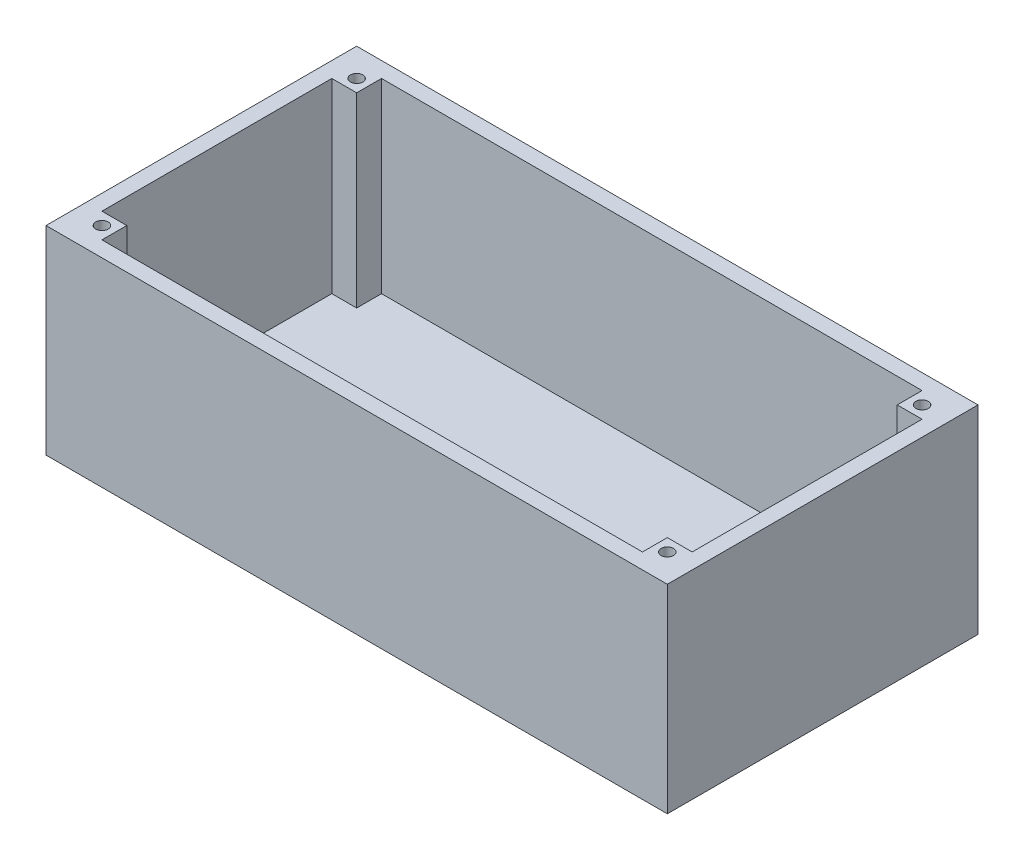
ISO-10303-21;
HEADER;
FILE_DESCRIPTION(('STEP AP214'),'2;1');
FILE_NAME('part.step','',(''),(''),'','','');
FILE_SCHEMA(('AUTOMOTIVE_DESIGN { 1 0 10303 214 1 1 1 1 }'));
ENDSEC;
DATA;
#1=APPLICATION_CONTEXT('core data for automotive mechanical design processes');
#2=APPLICATION_PROTOCOL_DEFINITION('international standard','automotive_design',2000,#1);
#3=PRODUCT_CONTEXT('',#1,'mechanical');
#4=PRODUCT('Part','Part','',(#3));
#5=PRODUCT_RELATED_PRODUCT_CATEGORY('part','',(#4));
#6=PRODUCT_DEFINITION_FORMATION('','',#4);
#7=PRODUCT_DEFINITION_CONTEXT('part definition',#1,'design');
#8=PRODUCT_DEFINITION('design','',#6,#7);
#9=PRODUCT_DEFINITION_SHAPE('','',#8);
#10=(LENGTH_UNIT() NAMED_UNIT(*) SI_UNIT(.MILLI.,.METRE.));
#11=(NAMED_UNIT(*) PLANE_ANGLE_UNIT() SI_UNIT($,.RADIAN.));
#12=(NAMED_UNIT(*) SI_UNIT($,.STERADIAN.) SOLID_ANGLE_UNIT());
#13=UNCERTAINTY_MEASURE_WITH_UNIT(LENGTH_MEASURE(1.E-05),#10,'distance_accuracy_value','');
#14=(GEOMETRIC_REPRESENTATION_CONTEXT(3) GLOBAL_UNCERTAINTY_ASSIGNED_CONTEXT((#13)) GLOBAL_UNIT_ASSIGNED_CONTEXT((#10,
#11,#12)) REPRESENTATION_CONTEXT('',''));
#15=CARTESIAN_POINT('',(0.,0.,0.));
#16=DIRECTION('',(0.,0.,1.));
#17=DIRECTION('',(1.,0.,0.));
#18=AXIS2_PLACEMENT_3D('',#15,#16,#17);
#19=CARTESIAN_POINT('',(0.,2.,0.));
#20=DIRECTION('',(1.,0.,0.));
#21=DIRECTION('',(0.,0.,-1.));
#22=AXIS2_PLACEMENT_3D('',#19,#20,#21);
#23=PLANE('',#22);
#24=DIRECTION('',(0.,0.,1.));
#25=VECTOR('',#24,1.);
#26=CARTESIAN_POINT('',(0.,0.,0.));
#27=LINE('',#26,#25);
#28=CARTESIAN_POINT('',(0.,0.,-50.));
#29=VERTEX_POINT('',#28);
#30=CARTESIAN_POINT('',(0.,0.,0.));
#31=VERTEX_POINT('',#30);
#32=EDGE_CURVE('E263',#29,#31,#27,.T.);
#33=ORIENTED_EDGE('',*,*,#32,.T.);
#34=DIRECTION('',(0.,-1.,0.));
#35=VECTOR('',#34,1.);
#36=CARTESIAN_POINT('',(0.,2.,0.));
#37=LINE('',#36,#35);
#38=CARTESIAN_POINT('',(0.,32.,0.));
#39=VERTEX_POINT('',#38);
#40=EDGE_CURVE('E11',#39,#31,#37,.T.);
#41=ORIENTED_EDGE('',*,*,#40,.F.);
#42=DIRECTION('',(0.,0.,1.));
#43=VECTOR('',#42,1.);
#44=CARTESIAN_POINT('',(0.,32.,-50.));
#45=LINE('',#44,#43);
#46=CARTESIAN_POINT('',(0.,32.,-50.));
#47=VERTEX_POINT('',#46);
#48=EDGE_CURVE('E249',#47,#39,#45,.T.);
#49=ORIENTED_EDGE('',*,*,#48,.F.);
#50=DIRECTION('',(0.,-1.,0.));
#51=VECTOR('',#50,1.);
#52=CARTESIAN_POINT('',(0.,2.,-50.));
#53=LINE('',#52,#51);
#54=EDGE_CURVE('E271',#47,#29,#53,.T.);
#55=ORIENTED_EDGE('',*,*,#54,.T.);
#56=EDGE_LOOP('',(#33,#41,#49,#55));
#57=FACE_BOUND('',#56,.T.);
#58=ADVANCED_FACE('F32',(#57),#23,.F.);
#59=CARTESIAN_POINT('',(0.,2.,0.));
#60=DIRECTION('',(0.,0.,-1.));
#61=DIRECTION('',(-1.,0.,0.));
#62=AXIS2_PLACEMENT_3D('',#59,#60,#61);
#63=PLANE('',#62);
#64=DIRECTION('',(1.,0.,0.));
#65=VECTOR('',#64,1.);
#66=CARTESIAN_POINT('',(0.,0.,0.));
#67=LINE('',#66,#65);
#68=CARTESIAN_POINT('',(100.,0.,0.));
#69=VERTEX_POINT('',#68);
#70=EDGE_CURVE('E266',#31,#69,#67,.T.);
#71=ORIENTED_EDGE('',*,*,#70,.T.);
#72=DIRECTION('',(0.,-1.,0.));
#73=VECTOR('',#72,1.);
#74=CARTESIAN_POINT('',(100.,2.,0.));
#75=LINE('',#74,#73);
#76=CARTESIAN_POINT('',(100.,32.,0.));
#77=VERTEX_POINT('',#76);
#78=EDGE_CURVE('E39',#77,#69,#75,.T.);
#79=ORIENTED_EDGE('',*,*,#78,.F.);
#80=DIRECTION('',(1.,0.,0.));
#81=VECTOR('',#80,1.);
#82=CARTESIAN_POINT('',(0.,32.,0.));
#83=LINE('',#82,#81);
#84=EDGE_CURVE('E254',#39,#77,#83,.T.);
#85=ORIENTED_EDGE('',*,*,#84,.F.);
#86=ORIENTED_EDGE('',*,*,#40,.T.);
#87=EDGE_LOOP('',(#71,#79,#85,#86));
#88=FACE_BOUND('',#87,.T.);
#89=ADVANCED_FACE('F290',(#88),#63,.F.);
#90=CARTESIAN_POINT('',(100.,2.,0.));
#91=DIRECTION('',(-1.,0.,0.));
#92=DIRECTION('',(0.,0.,1.));
#93=AXIS2_PLACEMENT_3D('',#90,#91,#92);
#94=PLANE('',#93);
#95=DIRECTION('',(0.,0.,-1.));
#96=VECTOR('',#95,1.);
#97=CARTESIAN_POINT('',(100.,0.,0.));
#98=LINE('',#97,#96);
#99=CARTESIAN_POINT('',(100.,0.,-50.));
#100=VERTEX_POINT('',#99);
#101=EDGE_CURVE('E268',#69,#100,#98,.T.);
#102=ORIENTED_EDGE('',*,*,#101,.T.);
#103=DIRECTION('',(0.,-1.,0.));
#104=VECTOR('',#103,1.);
#105=CARTESIAN_POINT('',(100.,2.,-50.));
#106=LINE('',#105,#104);
#107=CARTESIAN_POINT('',(100.,32.,-50.));
#108=VERTEX_POINT('',#107);
#109=EDGE_CURVE('E273',#108,#100,#106,.T.);
#110=ORIENTED_EDGE('',*,*,#109,.F.);
#111=DIRECTION('',(0.,0.,-1.));
#112=VECTOR('',#111,1.);
#113=CARTESIAN_POINT('',(100.,32.,-50.));
#114=LINE('',#113,#112);
#115=EDGE_CURVE('E257',#77,#108,#114,.T.);
#116=ORIENTED_EDGE('',*,*,#115,.F.);
#117=ORIENTED_EDGE('',*,*,#78,.T.);
#118=EDGE_LOOP('',(#102,#110,#116,#117));
#119=FACE_BOUND('',#118,.T.);
#120=ADVANCED_FACE('F278',(#119),#94,.F.);
#121=CARTESIAN_POINT('',(0.,2.,-50.));
#122=DIRECTION('',(0.,0.,1.));
#123=DIRECTION('',(1.,0.,0.));
#124=AXIS2_PLACEMENT_3D('',#121,#122,#123);
#125=PLANE('',#124);
#126=DIRECTION('',(-1.,0.,0.));
#127=VECTOR('',#126,1.);
#128=CARTESIAN_POINT('',(0.,0.,-50.));
#129=LINE('',#128,#127);
#130=EDGE_CURVE('E54',#100,#29,#129,.T.);
#131=ORIENTED_EDGE('',*,*,#130,.T.);
#132=ORIENTED_EDGE('',*,*,#54,.F.);
#133=DIRECTION('',(-1.,0.,0.));
#134=VECTOR('',#133,1.);
#135=CARTESIAN_POINT('',(0.,32.,-50.));
#136=LINE('',#135,#134);
#137=EDGE_CURVE('E260',#108,#47,#136,.T.);
#138=ORIENTED_EDGE('',*,*,#137,.F.);
#139=ORIENTED_EDGE('',*,*,#109,.T.);
#140=EDGE_LOOP('',(#131,#132,#138,#139));
#141=FACE_BOUND('',#140,.T.);
#142=ADVANCED_FACE('F287',(#141),#125,.F.);
#143=CARTESIAN_POINT('',(0.,0.,0.));
#144=DIRECTION('',(0.,-1.,0.));
#145=DIRECTION('',(0.,0.,-1.));
#146=AXIS2_PLACEMENT_3D('',#143,#144,#145);
#147=PLANE('',#146);
#148=ORIENTED_EDGE('',*,*,#32,.F.);
#149=ORIENTED_EDGE('',*,*,#130,.F.);
#150=ORIENTED_EDGE('',*,*,#101,.F.);
#151=ORIENTED_EDGE('',*,*,#70,.F.);
#152=EDGE_LOOP('',(#148,#149,#150,#151));
#153=FACE_BOUND('',#152,.T.);
#154=ADVANCED_FACE('F283',(#153),#147,.T.);
#155=CARTESIAN_POINT('',(0.,32.,0.));
#156=DIRECTION('',(0.,1.,0.));
#157=DIRECTION('',(0.,0.,1.));
#158=AXIS2_PLACEMENT_3D('',#155,#156,#157);
#159=PLANE('',#158);
#160=CARTESIAN_POINT('',(95.5000000000004,32.,-4.5));
#161=DIRECTION('',(0.,1.,0.));
#162=DIRECTION('',(0.,0.,1.));
#163=AXIS2_PLACEMENT_3D('',#160,#161,#162);
#164=CIRCLE('',#163,0.999999999999998);
#165=CARTESIAN_POINT('',(95.5000000000004,32.,-3.5));
#166=VERTEX_POINT('',#165);
#167=EDGE_CURVE('E387',#166,#166,#164,.T.);
#168=ORIENTED_EDGE('',*,*,#167,.F.);
#169=EDGE_LOOP('',(#168));
#170=FACE_BOUND('',#169,.T.);
#171=DIRECTION('',(-1.,0.,0.));
#172=VECTOR('',#171,1.);
#173=CARTESIAN_POINT('',(2.5,32.,-43.5));
#174=LINE('',#173,#172);
#175=CARTESIAN_POINT('',(6.5,32.,-43.5));
#176=VERTEX_POINT('',#175);
#177=CARTESIAN_POINT('',(2.5,32.,-43.5));
#178=VERTEX_POINT('',#177);
#179=EDGE_CURVE('E154',#176,#178,#174,.T.);
#180=ORIENTED_EDGE('',*,*,#179,.F.);
#181=DIRECTION('',(0.,0.,1.));
#182=VECTOR('',#181,1.);
#183=CARTESIAN_POINT('',(6.5,32.,-47.5));
#184=LINE('',#183,#182);
#185=CARTESIAN_POINT('',(6.5,32.,-47.5));
#186=VERTEX_POINT('',#185);
#187=EDGE_CURVE('E146',#186,#176,#184,.T.);
#188=ORIENTED_EDGE('',*,*,#187,.F.);
#189=DIRECTION('',(-1.,0.,0.));
#190=VECTOR('',#189,1.);
#191=CARTESIAN_POINT('',(6.5,32.,-47.5));
#192=LINE('',#191,#190);
#193=CARTESIAN_POINT('',(93.5,32.,-47.5));
#194=VERTEX_POINT('',#193);
#195=EDGE_CURVE('E191',#194,#186,#192,.T.);
#196=ORIENTED_EDGE('',*,*,#195,.F.);
#197=DIRECTION('',(0.,0.,-1.));
#198=VECTOR('',#197,1.);
#199=CARTESIAN_POINT('',(93.5,32.,-47.5));
#200=LINE('',#199,#198);
#201=CARTESIAN_POINT('',(93.5,32.,-43.5));
#202=VERTEX_POINT('',#201);
#203=EDGE_CURVE('E188',#202,#194,#200,.T.);
#204=ORIENTED_EDGE('',*,*,#203,.F.);
#205=DIRECTION('',(-1.,0.,0.));
#206=VECTOR('',#205,1.);
#207=CARTESIAN_POINT('',(97.5,32.,-43.5));
#208=LINE('',#207,#206);
#209=CARTESIAN_POINT('',(97.5,32.,-43.5));
#210=VERTEX_POINT('',#209);
#211=EDGE_CURVE('E186',#210,#202,#208,.T.);
#212=ORIENTED_EDGE('',*,*,#211,.F.);
#213=DIRECTION('',(0.,0.,-1.));
#214=VECTOR('',#213,1.);
#215=CARTESIAN_POINT('',(97.5,32.,-43.5));
#216=LINE('',#215,#214);
#217=CARTESIAN_POINT('',(97.5,32.,-6.50000000000001));
#218=VERTEX_POINT('',#217);
#219=EDGE_CURVE('E184',#218,#210,#216,.T.);
#220=ORIENTED_EDGE('',*,*,#219,.F.);
#221=DIRECTION('',(1.,0.,0.));
#222=VECTOR('',#221,1.);
#223=CARTESIAN_POINT('',(97.5,32.,-6.50000000000001));
#224=LINE('',#223,#222);
#225=CARTESIAN_POINT('',(93.5,32.,-6.50000000000001));
#226=VERTEX_POINT('',#225);
#227=EDGE_CURVE('E182',#226,#218,#224,.T.);
#228=ORIENTED_EDGE('',*,*,#227,.F.);
#229=DIRECTION('',(0.,0.,-1.));
#230=VECTOR('',#229,1.);
#231=CARTESIAN_POINT('',(93.5,32.,-2.5));
#232=LINE('',#231,#230);
#233=CARTESIAN_POINT('',(93.5,32.,-2.5));
#234=VERTEX_POINT('',#233);
#235=EDGE_CURVE('E180',#234,#226,#232,.T.);
#236=ORIENTED_EDGE('',*,*,#235,.F.);
#237=DIRECTION('',(1.,0.,0.));
#238=VECTOR('',#237,1.);
#239=CARTESIAN_POINT('',(6.5,32.,-2.5));
#240=LINE('',#239,#238);
#241=CARTESIAN_POINT('',(6.5,32.,-2.5));
#242=VERTEX_POINT('',#241);
#243=EDGE_CURVE('E178',#242,#234,#240,.T.);
#244=ORIENTED_EDGE('',*,*,#243,.F.);
#245=DIRECTION('',(0.,0.,1.));
#246=VECTOR('',#245,1.);
#247=CARTESIAN_POINT('',(6.5,32.,-2.5));
#248=LINE('',#247,#246);
#249=CARTESIAN_POINT('',(6.5,32.,-6.50000000000001));
#250=VERTEX_POINT('',#249);
#251=EDGE_CURVE('E176',#250,#242,#248,.T.);
#252=ORIENTED_EDGE('',*,*,#251,.F.);
#253=DIRECTION('',(1.,0.,0.));
#254=VECTOR('',#253,1.);
#255=CARTESIAN_POINT('',(2.5,32.,-6.50000000000001));
#256=LINE('',#255,#254);
#257=CARTESIAN_POINT('',(2.5,32.,-6.50000000000001));
#258=VERTEX_POINT('',#257);
#259=EDGE_CURVE('E171',#258,#250,#256,.T.);
#260=ORIENTED_EDGE('',*,*,#259,.F.);
#261=DIRECTION('',(0.,0.,1.));
#262=VECTOR('',#261,1.);
#263=CARTESIAN_POINT('',(2.5,32.,-43.5));
#264=LINE('',#263,#262);
#265=EDGE_CURVE('E169',#178,#258,#264,.T.);
#266=ORIENTED_EDGE('',*,*,#265,.F.);
#267=EDGE_LOOP('',(#180,#188,#196,#204,#212,#220,#228,#236,#244,#252,#260,#266));
#268=FACE_BOUND('',#267,.T.);
#269=CARTESIAN_POINT('',(4.5,32.,-45.5));
#270=DIRECTION('',(0.,1.,0.));
#271=DIRECTION('',(0.,0.,1.));
#272=AXIS2_PLACEMENT_3D('',#269,#270,#271);
#273=CIRCLE('',#272,1.);
#274=CARTESIAN_POINT('',(4.5,32.,-44.5));
#275=VERTEX_POINT('',#274);
#276=EDGE_CURVE('E246',#275,#275,#273,.T.);
#277=ORIENTED_EDGE('',*,*,#276,.F.);
#278=EDGE_LOOP('',(#277));
#279=FACE_BOUND('',#278,.T.);
#280=ORIENTED_EDGE('',*,*,#48,.T.);
#281=ORIENTED_EDGE('',*,*,#84,.T.);
#282=ORIENTED_EDGE('',*,*,#115,.T.);
#283=ORIENTED_EDGE('',*,*,#137,.T.);
#284=EDGE_LOOP('',(#280,#281,#282,#283));
#285=FACE_BOUND('',#284,.T.);
#286=CARTESIAN_POINT('',(95.5,32.,-45.5));
#287=DIRECTION('',(0.,1.,0.));
#288=DIRECTION('',(0.,0.,1.));
#289=AXIS2_PLACEMENT_3D('',#286,#287,#288);
#290=CIRCLE('',#289,0.999999999999998);
#291=CARTESIAN_POINT('',(95.5,32.,-44.5));
#292=VERTEX_POINT('',#291);
#293=EDGE_CURVE('E195',#292,#292,#290,.T.);
#294=ORIENTED_EDGE('',*,*,#293,.F.);
#295=EDGE_LOOP('',(#294));
#296=FACE_BOUND('',#295,.T.);
#297=CARTESIAN_POINT('',(4.50000000000043,32.,-4.5));
#298=DIRECTION('',(0.,1.,0.));
#299=DIRECTION('',(0.,0.,1.));
#300=AXIS2_PLACEMENT_3D('',#297,#298,#299);
#301=CIRCLE('',#300,1.);
#302=CARTESIAN_POINT('',(4.50000000000043,32.,-3.5));
#303=VERTEX_POINT('',#302);
#304=EDGE_CURVE('E378',#303,#303,#301,.T.);
#305=ORIENTED_EDGE('',*,*,#304,.F.);
#306=EDGE_LOOP('',(#305));
#307=FACE_BOUND('',#306,.T.);
#308=ADVANCED_FACE('F166',(#170,#268,#279,#285,#296,#307),#159,.T.);
#309=CARTESIAN_POINT('',(4.5,32.,-45.5));
#310=DIRECTION('',(0.,-1.,0.));
#311=DIRECTION('',(0.,0.,-1.));
#312=AXIS2_PLACEMENT_3D('',#309,#310,#311);
#313=CYLINDRICAL_SURFACE('',#312,1.);
#314=ORIENTED_EDGE('',*,*,#276,.T.);
#315=EDGE_LOOP('',(#314));
#316=FACE_BOUND('',#315,.T.);
#317=CARTESIAN_POINT('',(4.5,2.,-45.5));
#318=DIRECTION('',(0.,1.,0.));
#319=DIRECTION('',(0.,0.,1.));
#320=AXIS2_PLACEMENT_3D('',#317,#318,#319);
#321=CIRCLE('',#320,1.);
#322=CARTESIAN_POINT('',(4.5,2.,-44.5));
#323=VERTEX_POINT('',#322);
#324=EDGE_CURVE('E162',#323,#323,#321,.T.);
#325=ORIENTED_EDGE('',*,*,#324,.F.);
#326=EDGE_LOOP('',(#325));
#327=FACE_BOUND('',#326,.T.);
#328=ADVANCED_FACE('F310',(#316,#327),#313,.F.);
#329=CARTESIAN_POINT('',(6.5,32.,-47.5));
#330=DIRECTION('',(1.,0.,0.));
#331=DIRECTION('',(0.,0.,-1.));
#332=AXIS2_PLACEMENT_3D('',#329,#330,#331);
#333=PLANE('',#332);
#334=DIRECTION('',(0.,0.,1.));
#335=VECTOR('',#334,1.);
#336=CARTESIAN_POINT('',(6.5,2.,-47.5));
#337=LINE('',#336,#335);
#338=CARTESIAN_POINT('',(6.5,2.,-47.5));
#339=VERTEX_POINT('',#338);
#340=CARTESIAN_POINT('',(6.5,2.,-43.5));
#341=VERTEX_POINT('',#340);
#342=EDGE_CURVE('E193',#339,#341,#337,.T.);
#343=ORIENTED_EDGE('',*,*,#342,.F.);
#344=DIRECTION('',(0.,-1.,0.));
#345=VECTOR('',#344,1.);
#346=CARTESIAN_POINT('',(6.5,32.,-47.5));
#347=LINE('',#346,#345);
#348=EDGE_CURVE('E46',#186,#339,#347,.T.);
#349=ORIENTED_EDGE('',*,*,#348,.F.);
#350=ORIENTED_EDGE('',*,*,#187,.T.);
#351=DIRECTION('',(0.,-1.,0.));
#352=VECTOR('',#351,1.);
#353=CARTESIAN_POINT('',(6.5,32.,-43.5));
#354=LINE('',#353,#352);
#355=EDGE_CURVE('E149',#176,#341,#354,.T.);
#356=ORIENTED_EDGE('',*,*,#355,.T.);
#357=EDGE_LOOP('',(#343,#349,#350,#356));
#358=FACE_BOUND('',#357,.T.);
#359=ADVANCED_FACE('F148',(#358),#333,.T.);
#360=CARTESIAN_POINT('',(2.5,32.,-43.5));
#361=DIRECTION('',(0.,0.,1.));
#362=DIRECTION('',(1.,0.,0.));
#363=AXIS2_PLACEMENT_3D('',#360,#361,#362);
#364=PLANE('',#363);
#365=DIRECTION('',(-1.,0.,0.));
#366=VECTOR('',#365,1.);
#367=CARTESIAN_POINT('',(2.5,2.,-43.5));
#368=LINE('',#367,#366);
#369=CARTESIAN_POINT('',(2.5,2.,-43.5));
#370=VERTEX_POINT('',#369);
#371=EDGE_CURVE('E161',#341,#370,#368,.T.);
#372=ORIENTED_EDGE('',*,*,#371,.F.);
#373=ORIENTED_EDGE('',*,*,#355,.F.);
#374=ORIENTED_EDGE('',*,*,#179,.T.);
#375=DIRECTION('',(0.,-1.,0.));
#376=VECTOR('',#375,1.);
#377=CARTESIAN_POINT('',(2.5,32.,-43.5));
#378=LINE('',#377,#376);
#379=EDGE_CURVE('E163',#178,#370,#378,.T.);
#380=ORIENTED_EDGE('',*,*,#379,.T.);
#381=EDGE_LOOP('',(#372,#373,#374,#380));
#382=FACE_BOUND('',#381,.T.);
#383=ADVANCED_FACE('F158',(#382),#364,.T.);
#384=CARTESIAN_POINT('',(2.5,32.,-43.5));
#385=DIRECTION('',(1.,0.,0.));
#386=DIRECTION('',(0.,0.,-1.));
#387=AXIS2_PLACEMENT_3D('',#384,#385,#386);
#388=PLANE('',#387);
#389=DIRECTION('',(0.,0.,1.));
#390=VECTOR('',#389,1.);
#391=CARTESIAN_POINT('',(2.5,2.,-43.5));
#392=LINE('',#391,#390);
#393=CARTESIAN_POINT('',(2.5,2.,-6.50000000000001));
#394=VERTEX_POINT('',#393);
#395=EDGE_CURVE('E197',#370,#394,#392,.T.);
#396=ORIENTED_EDGE('',*,*,#395,.F.);
#397=ORIENTED_EDGE('',*,*,#379,.F.);
#398=ORIENTED_EDGE('',*,*,#265,.T.);
#399=DIRECTION('',(0.,-1.,0.));
#400=VECTOR('',#399,1.);
#401=CARTESIAN_POINT('',(2.5,32.,-6.50000000000001));
#402=LINE('',#401,#400);
#403=EDGE_CURVE('E243',#258,#394,#402,.T.);
#404=ORIENTED_EDGE('',*,*,#403,.T.);
#405=EDGE_LOOP('',(#396,#397,#398,#404));
#406=FACE_BOUND('',#405,.T.);
#407=ADVANCED_FACE('F319',(#406),#388,.T.);
#408=CARTESIAN_POINT('',(2.5,32.,-6.50000000000001));
#409=DIRECTION('',(0.,0.,-1.));
#410=DIRECTION('',(-1.,0.,0.));
#411=AXIS2_PLACEMENT_3D('',#408,#409,#410);
#412=PLANE('',#411);
#413=DIRECTION('',(1.,0.,0.));
#414=VECTOR('',#413,1.);
#415=CARTESIAN_POINT('',(2.5,2.,-6.50000000000001));
#416=LINE('',#415,#414);
#417=CARTESIAN_POINT('',(6.5,2.,-6.50000000000001));
#418=VERTEX_POINT('',#417);
#419=EDGE_CURVE('E200',#394,#418,#416,.T.);
#420=ORIENTED_EDGE('',*,*,#419,.F.);
#421=ORIENTED_EDGE('',*,*,#403,.F.);
#422=ORIENTED_EDGE('',*,*,#259,.T.);
#423=DIRECTION('',(0.,-1.,0.));
#424=VECTOR('',#423,1.);
#425=CARTESIAN_POINT('',(6.5,32.,-6.50000000000001));
#426=LINE('',#425,#424);
#427=EDGE_CURVE('E241',#250,#418,#426,.T.);
#428=ORIENTED_EDGE('',*,*,#427,.T.);
#429=EDGE_LOOP('',(#420,#421,#422,#428));
#430=FACE_BOUND('',#429,.T.);
#431=ADVANCED_FACE('F322',(#430),#412,.T.);
#432=CARTESIAN_POINT('',(6.5,32.,-2.5));
#433=DIRECTION('',(1.,0.,0.));
#434=DIRECTION('',(0.,0.,-1.));
#435=AXIS2_PLACEMENT_3D('',#432,#433,#434);
#436=PLANE('',#435);
#437=DIRECTION('',(0.,0.,1.));
#438=VECTOR('',#437,1.);
#439=CARTESIAN_POINT('',(6.5,2.,-2.5));
#440=LINE('',#439,#438);
#441=CARTESIAN_POINT('',(6.5,2.,-2.5));
#442=VERTEX_POINT('',#441);
#443=EDGE_CURVE('E203',#418,#442,#440,.T.);
#444=ORIENTED_EDGE('',*,*,#443,.F.);
#445=ORIENTED_EDGE('',*,*,#427,.F.);
#446=ORIENTED_EDGE('',*,*,#251,.T.);
#447=DIRECTION('',(0.,-1.,0.));
#448=VECTOR('',#447,1.);
#449=CARTESIAN_POINT('',(6.5,32.,-2.5));
#450=LINE('',#449,#448);
#451=EDGE_CURVE('E239',#242,#442,#450,.T.);
#452=ORIENTED_EDGE('',*,*,#451,.T.);
#453=EDGE_LOOP('',(#444,#445,#446,#452));
#454=FACE_BOUND('',#453,.T.);
#455=ADVANCED_FACE('F326',(#454),#436,.T.);
#456=CARTESIAN_POINT('',(6.5,32.,-2.5));
#457=DIRECTION('',(0.,0.,-1.));
#458=DIRECTION('',(-1.,0.,0.));
#459=AXIS2_PLACEMENT_3D('',#456,#457,#458);
#460=PLANE('',#459);
#461=DIRECTION('',(1.,0.,0.));
#462=VECTOR('',#461,1.);
#463=CARTESIAN_POINT('',(6.5,2.,-2.5));
#464=LINE('',#463,#462);
#465=CARTESIAN_POINT('',(93.5,2.,-2.5));
#466=VERTEX_POINT('',#465);
#467=EDGE_CURVE('E206',#442,#466,#464,.T.);
#468=ORIENTED_EDGE('',*,*,#467,.F.);
#469=ORIENTED_EDGE('',*,*,#451,.F.);
#470=ORIENTED_EDGE('',*,*,#243,.T.);
#471=DIRECTION('',(0.,-1.,0.));
#472=VECTOR('',#471,1.);
#473=CARTESIAN_POINT('',(93.5,32.,-2.5));
#474=LINE('',#473,#472);
#475=EDGE_CURVE('E237',#234,#466,#474,.T.);
#476=ORIENTED_EDGE('',*,*,#475,.T.);
#477=EDGE_LOOP('',(#468,#469,#470,#476));
#478=FACE_BOUND('',#477,.T.);
#479=ADVANCED_FACE('F330',(#478),#460,.T.);
#480=CARTESIAN_POINT('',(93.5,32.,-2.5));
#481=DIRECTION('',(-1.,0.,0.));
#482=DIRECTION('',(0.,0.,1.));
#483=AXIS2_PLACEMENT_3D('',#480,#481,#482);
#484=PLANE('',#483);
#485=DIRECTION('',(0.,0.,-1.));
#486=VECTOR('',#485,1.);
#487=CARTESIAN_POINT('',(93.5,2.,-2.5));
#488=LINE('',#487,#486);
#489=CARTESIAN_POINT('',(93.5,2.,-6.50000000000001));
#490=VERTEX_POINT('',#489);
#491=EDGE_CURVE('E209',#466,#490,#488,.T.);
#492=ORIENTED_EDGE('',*,*,#491,.F.);
#493=ORIENTED_EDGE('',*,*,#475,.F.);
#494=ORIENTED_EDGE('',*,*,#235,.T.);
#495=DIRECTION('',(0.,-1.,0.));
#496=VECTOR('',#495,1.);
#497=CARTESIAN_POINT('',(93.5,32.,-6.50000000000001));
#498=LINE('',#497,#496);
#499=EDGE_CURVE('E235',#226,#490,#498,.T.);
#500=ORIENTED_EDGE('',*,*,#499,.T.);
#501=EDGE_LOOP('',(#492,#493,#494,#500));
#502=FACE_BOUND('',#501,.T.);
#503=ADVANCED_FACE('F334',(#502),#484,.T.);
#504=CARTESIAN_POINT('',(97.5,32.,-6.50000000000001));
#505=DIRECTION('',(0.,0.,-1.));
#506=DIRECTION('',(-1.,0.,0.));
#507=AXIS2_PLACEMENT_3D('',#504,#505,#506);
#508=PLANE('',#507);
#509=DIRECTION('',(1.,0.,0.));
#510=VECTOR('',#509,1.);
#511=CARTESIAN_POINT('',(97.5,2.,-6.50000000000001));
#512=LINE('',#511,#510);
#513=CARTESIAN_POINT('',(97.5,2.,-6.50000000000001));
#514=VERTEX_POINT('',#513);
#515=EDGE_CURVE('E212',#490,#514,#512,.T.);
#516=ORIENTED_EDGE('',*,*,#515,.F.);
#517=ORIENTED_EDGE('',*,*,#499,.F.);
#518=ORIENTED_EDGE('',*,*,#227,.T.);
#519=DIRECTION('',(0.,-1.,0.));
#520=VECTOR('',#519,1.);
#521=CARTESIAN_POINT('',(97.5,32.,-6.50000000000001));
#522=LINE('',#521,#520);
#523=EDGE_CURVE('E233',#218,#514,#522,.T.);
#524=ORIENTED_EDGE('',*,*,#523,.T.);
#525=EDGE_LOOP('',(#516,#517,#518,#524));
#526=FACE_BOUND('',#525,.T.);
#527=ADVANCED_FACE('F338',(#526),#508,.T.);
#528=CARTESIAN_POINT('',(97.5,32.,-43.5));
#529=DIRECTION('',(-1.,0.,0.));
#530=DIRECTION('',(0.,0.,1.));
#531=AXIS2_PLACEMENT_3D('',#528,#529,#530);
#532=PLANE('',#531);
#533=DIRECTION('',(0.,0.,-1.));
#534=VECTOR('',#533,1.);
#535=CARTESIAN_POINT('',(97.5,2.,-43.5));
#536=LINE('',#535,#534);
#537=CARTESIAN_POINT('',(97.5,2.,-43.5));
#538=VERTEX_POINT('',#537);
#539=EDGE_CURVE('E215',#514,#538,#536,.T.);
#540=ORIENTED_EDGE('',*,*,#539,.F.);
#541=ORIENTED_EDGE('',*,*,#523,.F.);
#542=ORIENTED_EDGE('',*,*,#219,.T.);
#543=DIRECTION('',(0.,-1.,0.));
#544=VECTOR('',#543,1.);
#545=CARTESIAN_POINT('',(97.5,32.,-43.5));
#546=LINE('',#545,#544);
#547=EDGE_CURVE('E231',#210,#538,#546,.T.);
#548=ORIENTED_EDGE('',*,*,#547,.T.);
#549=EDGE_LOOP('',(#540,#541,#542,#548));
#550=FACE_BOUND('',#549,.T.);
#551=ADVANCED_FACE('F342',(#550),#532,.T.);
#552=CARTESIAN_POINT('',(97.5,32.,-43.5));
#553=DIRECTION('',(0.,0.,1.));
#554=DIRECTION('',(1.,0.,0.));
#555=AXIS2_PLACEMENT_3D('',#552,#553,#554);
#556=PLANE('',#555);
#557=DIRECTION('',(-1.,0.,0.));
#558=VECTOR('',#557,1.);
#559=CARTESIAN_POINT('',(97.5,2.,-43.5));
#560=LINE('',#559,#558);
#561=CARTESIAN_POINT('',(93.5,2.,-43.5));
#562=VERTEX_POINT('',#561);
#563=EDGE_CURVE('E218',#538,#562,#560,.T.);
#564=ORIENTED_EDGE('',*,*,#563,.F.);
#565=ORIENTED_EDGE('',*,*,#547,.F.);
#566=ORIENTED_EDGE('',*,*,#211,.T.);
#567=DIRECTION('',(0.,-1.,0.));
#568=VECTOR('',#567,1.);
#569=CARTESIAN_POINT('',(93.5,32.,-43.5));
#570=LINE('',#569,#568);
#571=EDGE_CURVE('E229',#202,#562,#570,.T.);
#572=ORIENTED_EDGE('',*,*,#571,.T.);
#573=EDGE_LOOP('',(#564,#565,#566,#572));
#574=FACE_BOUND('',#573,.T.);
#575=ADVANCED_FACE('F346',(#574),#556,.T.);
#576=CARTESIAN_POINT('',(93.5,32.,-47.5));
#577=DIRECTION('',(-1.,0.,0.));
#578=DIRECTION('',(0.,0.,1.));
#579=AXIS2_PLACEMENT_3D('',#576,#577,#578);
#580=PLANE('',#579);
#581=DIRECTION('',(0.,0.,-1.));
#582=VECTOR('',#581,1.);
#583=CARTESIAN_POINT('',(93.5,2.,-47.5));
#584=LINE('',#583,#582);
#585=CARTESIAN_POINT('',(93.5,2.,-47.5));
#586=VERTEX_POINT('',#585);
#587=EDGE_CURVE('E221',#562,#586,#584,.T.);
#588=ORIENTED_EDGE('',*,*,#587,.F.);
#589=ORIENTED_EDGE('',*,*,#571,.F.);
#590=ORIENTED_EDGE('',*,*,#203,.T.);
#591=DIRECTION('',(0.,-1.,0.));
#592=VECTOR('',#591,1.);
#593=CARTESIAN_POINT('',(93.5,32.,-47.5));
#594=LINE('',#593,#592);
#595=EDGE_CURVE('E227',#194,#586,#594,.T.);
#596=ORIENTED_EDGE('',*,*,#595,.T.);
#597=EDGE_LOOP('',(#588,#589,#590,#596));
#598=FACE_BOUND('',#597,.T.);
#599=ADVANCED_FACE('F350',(#598),#580,.T.);
#600=CARTESIAN_POINT('',(6.5,32.,-47.5));
#601=DIRECTION('',(0.,0.,1.));
#602=DIRECTION('',(1.,0.,0.));
#603=AXIS2_PLACEMENT_3D('',#600,#601,#602);
#604=PLANE('',#603);
#605=DIRECTION('',(-1.,0.,0.));
#606=VECTOR('',#605,1.);
#607=CARTESIAN_POINT('',(6.5,2.,-47.5));
#608=LINE('',#607,#606);
#609=EDGE_CURVE('E155',#586,#339,#608,.T.);
#610=ORIENTED_EDGE('',*,*,#609,.F.);
#611=ORIENTED_EDGE('',*,*,#595,.F.);
#612=ORIENTED_EDGE('',*,*,#195,.T.);
#613=ORIENTED_EDGE('',*,*,#348,.T.);
#614=EDGE_LOOP('',(#610,#611,#612,#613));
#615=FACE_BOUND('',#614,.T.);
#616=ADVANCED_FACE('F354',(#615),#604,.T.);
#617=CARTESIAN_POINT('',(95.5,32.,-45.5));
#618=DIRECTION('',(0.,-1.,0.));
#619=DIRECTION('',(0.,0.,-1.));
#620=AXIS2_PLACEMENT_3D('',#617,#618,#619);
#621=CYLINDRICAL_SURFACE('',#620,0.999999999999998);
#622=ORIENTED_EDGE('',*,*,#293,.T.);
#623=EDGE_LOOP('',(#622));
#624=FACE_BOUND('',#623,.T.);
#625=CARTESIAN_POINT('',(95.5,2.,-45.5));
#626=DIRECTION('',(0.,1.,0.));
#627=DIRECTION('',(0.,0.,1.));
#628=AXIS2_PLACEMENT_3D('',#625,#626,#627);
#629=CIRCLE('',#628,0.999999999999998);
#630=CARTESIAN_POINT('',(95.5,2.,-44.5));
#631=VERTEX_POINT('',#630);
#632=EDGE_CURVE('E390',#631,#631,#629,.T.);
#633=ORIENTED_EDGE('',*,*,#632,.F.);
#634=EDGE_LOOP('',(#633));
#635=FACE_BOUND('',#634,.T.);
#636=ADVANCED_FACE('F358',(#624,#635),#621,.F.);
#637=CARTESIAN_POINT('',(95.5000000000004,32.,-4.5));
#638=DIRECTION('',(0.,-1.,0.));
#639=DIRECTION('',(0.,0.,-1.));
#640=AXIS2_PLACEMENT_3D('',#637,#638,#639);
#641=CYLINDRICAL_SURFACE('',#640,0.999999999999998);
#642=ORIENTED_EDGE('',*,*,#167,.T.);
#643=EDGE_LOOP('',(#642));
#644=FACE_BOUND('',#643,.T.);
#645=CARTESIAN_POINT('',(95.5000000000004,2.,-4.5));
#646=DIRECTION('',(0.,1.,0.));
#647=DIRECTION('',(0.,0.,1.));
#648=AXIS2_PLACEMENT_3D('',#645,#646,#647);
#649=CIRCLE('',#648,0.999999999999998);
#650=CARTESIAN_POINT('',(95.5000000000004,2.,-3.5));
#651=VERTEX_POINT('',#650);
#652=EDGE_CURVE('E384',#651,#651,#649,.T.);
#653=ORIENTED_EDGE('',*,*,#652,.F.);
#654=EDGE_LOOP('',(#653));
#655=FACE_BOUND('',#654,.T.);
#656=ADVANCED_FACE('F361',(#644,#655),#641,.F.);
#657=CARTESIAN_POINT('',(4.50000000000043,32.,-4.5));
#658=DIRECTION('',(0.,-1.,0.));
#659=DIRECTION('',(0.,0.,-1.));
#660=AXIS2_PLACEMENT_3D('',#657,#658,#659);
#661=CYLINDRICAL_SURFACE('',#660,1.);
#662=ORIENTED_EDGE('',*,*,#304,.T.);
#663=EDGE_LOOP('',(#662));
#664=FACE_BOUND('',#663,.T.);
#665=CARTESIAN_POINT('',(4.50000000000043,2.,-4.5));
#666=DIRECTION('',(0.,1.,0.));
#667=DIRECTION('',(0.,0.,1.));
#668=AXIS2_PLACEMENT_3D('',#665,#666,#667);
#669=CIRCLE('',#668,1.);
#670=CARTESIAN_POINT('',(4.50000000000043,2.,-3.5));
#671=VERTEX_POINT('',#670);
#672=EDGE_CURVE('E381',#671,#671,#669,.T.);
#673=ORIENTED_EDGE('',*,*,#672,.F.);
#674=EDGE_LOOP('',(#673));
#675=FACE_BOUND('',#674,.T.);
#676=ADVANCED_FACE('F365',(#664,#675),#661,.F.);
#677=CARTESIAN_POINT('',(0.,2.,0.));
#678=DIRECTION('',(0.,-1.,0.));
#679=DIRECTION('',(0.,0.,-1.));
#680=AXIS2_PLACEMENT_3D('',#677,#678,#679);
#681=PLANE('',#680);
#682=ORIENTED_EDGE('',*,*,#652,.T.);
#683=EDGE_LOOP('',(#682));
#684=FACE_BOUND('',#683,.T.);
#685=ADVANCED_FACE('F368',(#684),#681,.F.);
#686=ORIENTED_EDGE('',*,*,#632,.T.);
#687=EDGE_LOOP('',(#686));
#688=FACE_BOUND('',#687,.T.);
#689=ADVANCED_FACE('F373',(#688),#681,.F.);
#690=ORIENTED_EDGE('',*,*,#609,.T.);
#691=ORIENTED_EDGE('',*,*,#342,.T.);
#692=ORIENTED_EDGE('',*,*,#371,.T.);
#693=ORIENTED_EDGE('',*,*,#395,.T.);
#694=ORIENTED_EDGE('',*,*,#419,.T.);
#695=ORIENTED_EDGE('',*,*,#443,.T.);
#696=ORIENTED_EDGE('',*,*,#467,.T.);
#697=ORIENTED_EDGE('',*,*,#491,.T.);
#698=ORIENTED_EDGE('',*,*,#515,.T.);
#699=ORIENTED_EDGE('',*,*,#539,.T.);
#700=ORIENTED_EDGE('',*,*,#563,.T.);
#701=ORIENTED_EDGE('',*,*,#587,.T.);
#702=EDGE_LOOP('',(#690,#691,#692,#693,#694,#695,#696,#697,#698,#699,#700,#701));
#703=FACE_BOUND('',#702,.T.);
#704=ADVANCED_FACE('F306',(#703),#681,.F.);
#705=ORIENTED_EDGE('',*,*,#324,.T.);
#706=EDGE_LOOP('',(#705));
#707=FACE_BOUND('',#706,.T.);
#708=ADVANCED_FACE('F302',(#707),#681,.F.);
#709=ORIENTED_EDGE('',*,*,#672,.T.);
#710=EDGE_LOOP('',(#709));
#711=FACE_BOUND('',#710,.T.);
#712=ADVANCED_FACE('F305',(#711),#681,.F.);
#713=CLOSED_SHELL('',(#58,#89,#120,#142,#154,#308,#328,#359,#383,#407,#431,#455,#479,#503,#527,
#551,#575,#599,#616,#636,#656,#676,#685,#689,#704,#708,#712));
#714=MANIFOLD_SOLID_BREP('B2',#713);
#715=ADVANCED_BREP_SHAPE_REPRESENTATION('',(#18,#714),#14);
#716=SHAPE_DEFINITION_REPRESENTATION(#9,#715);
ENDSEC;
END-ISO-10303-21;
